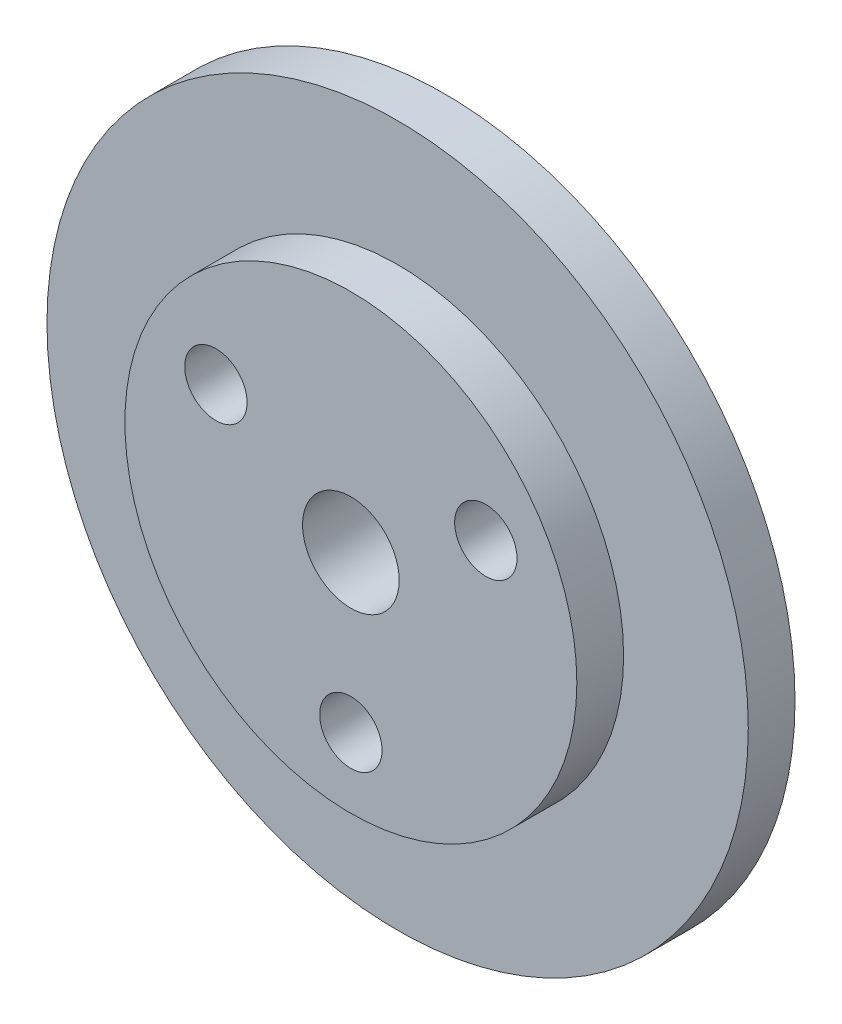
ISO-10303-21;
HEADER;
FILE_DESCRIPTION(('STEP AP214'),'2;1');
FILE_NAME('part.step','',(''),(''),'','','');
FILE_SCHEMA(('AUTOMOTIVE_DESIGN { 1 0 10303 214 1 1 1 1 }'));
ENDSEC;
DATA;
#1=APPLICATION_CONTEXT('core data for automotive mechanical design processes');
#2=APPLICATION_PROTOCOL_DEFINITION('international standard','automotive_design',2000,#1);
#3=PRODUCT_CONTEXT('',#1,'mechanical');
#4=PRODUCT('Part','Part','',(#3));
#5=PRODUCT_RELATED_PRODUCT_CATEGORY('part','',(#4));
#6=PRODUCT_DEFINITION_FORMATION('','',#4);
#7=PRODUCT_DEFINITION_CONTEXT('part definition',#1,'design');
#8=PRODUCT_DEFINITION('design','',#6,#7);
#9=PRODUCT_DEFINITION_SHAPE('','',#8);
#10=(LENGTH_UNIT() NAMED_UNIT(*) SI_UNIT(.MILLI.,.METRE.));
#11=(NAMED_UNIT(*) PLANE_ANGLE_UNIT() SI_UNIT($,.RADIAN.));
#12=(NAMED_UNIT(*) SI_UNIT($,.STERADIAN.) SOLID_ANGLE_UNIT());
#13=UNCERTAINTY_MEASURE_WITH_UNIT(LENGTH_MEASURE(1.E-05),#10,'distance_accuracy_value','');
#14=(GEOMETRIC_REPRESENTATION_CONTEXT(3) GLOBAL_UNCERTAINTY_ASSIGNED_CONTEXT((#13)) GLOBAL_UNIT_ASSIGNED_CONTEXT((#10,
#11,#12)) REPRESENTATION_CONTEXT('',''));
#15=CARTESIAN_POINT('',(0.,0.,0.));
#16=DIRECTION('',(0.,0.,1.));
#17=DIRECTION('',(1.,0.,0.));
#18=AXIS2_PLACEMENT_3D('',#15,#16,#17);
#19=CARTESIAN_POINT('',(0.,0.,3.));
#20=DIRECTION('',(0.,0.,-1.));
#21=DIRECTION('',(-1.,0.,0.));
#22=AXIS2_PLACEMENT_3D('',#19,#20,#21);
#23=CYLINDRICAL_SURFACE('',#22,22.5);
#24=CARTESIAN_POINT('',(0.,0.,3.));
#25=DIRECTION('',(0.,0.,1.));
#26=DIRECTION('',(1.,0.,0.));
#27=AXIS2_PLACEMENT_3D('',#24,#25,#26);
#28=CIRCLE('',#27,22.5);
#29=CARTESIAN_POINT('',(22.5,0.,3.));
#30=VERTEX_POINT('',#29);
#31=EDGE_CURVE('E10',#30,#30,#28,.T.);
#32=ORIENTED_EDGE('',*,*,#31,.F.);
#33=EDGE_LOOP('',(#32));
#34=FACE_BOUND('',#33,.T.);
#35=CARTESIAN_POINT('',(0.,0.,0.));
#36=DIRECTION('',(0.,0.,1.));
#37=DIRECTION('',(1.,0.,0.));
#38=AXIS2_PLACEMENT_3D('',#35,#36,#37);
#39=CIRCLE('',#38,22.5);
#40=CARTESIAN_POINT('',(22.5,0.,0.));
#41=VERTEX_POINT('',#40);
#42=EDGE_CURVE('E34',#41,#41,#39,.T.);
#43=ORIENTED_EDGE('',*,*,#42,.T.);
#44=EDGE_LOOP('',(#43));
#45=FACE_BOUND('',#44,.T.);
#46=ADVANCED_FACE('F31',(#34,#45),#23,.T.);
#47=CARTESIAN_POINT('',(0.,0.,3.));
#48=DIRECTION('',(0.,0.,1.));
#49=DIRECTION('',(1.,0.,0.));
#50=AXIS2_PLACEMENT_3D('',#47,#48,#49);
#51=PLANE('',#50);
#52=CARTESIAN_POINT('',(0.,0.,3.));
#53=DIRECTION('',(0.,0.,1.));
#54=DIRECTION('',(1.,0.,0.));
#55=AXIS2_PLACEMENT_3D('',#52,#53,#54);
#56=CIRCLE('',#55,14.5);
#57=CARTESIAN_POINT('',(14.5,0.,3.));
#58=VERTEX_POINT('',#57);
#59=EDGE_CURVE('E43',#58,#58,#56,.T.);
#60=ORIENTED_EDGE('',*,*,#59,.F.);
#61=EDGE_LOOP('',(#60));
#62=FACE_BOUND('',#61,.T.);
#63=ORIENTED_EDGE('',*,*,#31,.T.);
#64=EDGE_LOOP('',(#63));
#65=FACE_BOUND('',#64,.T.);
#66=ADVANCED_FACE('F102',(#62,#65),#51,.T.);
#67=CARTESIAN_POINT('',(0.,0.,0.));
#68=DIRECTION('',(0.,0.,1.));
#69=DIRECTION('',(1.,0.,0.));
#70=AXIS2_PLACEMENT_3D('',#67,#68,#69);
#71=PLANE('',#70);
#72=CARTESIAN_POINT('',(-8.66025403784436,5.00000000000004,0.));
#73=DIRECTION('',(0.,0.,1.));
#74=DIRECTION('',(1.,0.,0.));
#75=AXIS2_PLACEMENT_3D('',#72,#73,#74);
#76=CIRCLE('',#75,2.);
#77=CARTESIAN_POINT('',(-6.66025403784436,5.00000000000004,0.));
#78=VERTEX_POINT('',#77);
#79=EDGE_CURVE('E52',#78,#78,#76,.T.);
#80=ORIENTED_EDGE('',*,*,#79,.T.);
#81=EDGE_LOOP('',(#80));
#82=FACE_BOUND('',#81,.T.);
#83=CARTESIAN_POINT('',(0.,-10.,0.));
#84=DIRECTION('',(0.,0.,1.));
#85=DIRECTION('',(1.,0.,0.));
#86=AXIS2_PLACEMENT_3D('',#83,#84,#85);
#87=CIRCLE('',#86,2.);
#88=CARTESIAN_POINT('',(2.,-10.,0.));
#89=VERTEX_POINT('',#88);
#90=EDGE_CURVE('E64',#89,#89,#87,.T.);
#91=ORIENTED_EDGE('',*,*,#90,.T.);
#92=EDGE_LOOP('',(#91));
#93=FACE_BOUND('',#92,.T.);
#94=CARTESIAN_POINT('',(0.,0.,0.));
#95=DIRECTION('',(0.,0.,1.));
#96=DIRECTION('',(1.,0.,0.));
#97=AXIS2_PLACEMENT_3D('',#94,#95,#96);
#98=CIRCLE('',#97,3.1);
#99=CARTESIAN_POINT('',(3.1,0.,0.));
#100=VERTEX_POINT('',#99);
#101=EDGE_CURVE('E58',#100,#100,#98,.T.);
#102=ORIENTED_EDGE('',*,*,#101,.T.);
#103=EDGE_LOOP('',(#102));
#104=FACE_BOUND('',#103,.T.);
#105=CARTESIAN_POINT('',(8.66025403784436,5.00000000000004,0.));
#106=DIRECTION('',(0.,0.,1.));
#107=DIRECTION('',(1.,0.,0.));
#108=AXIS2_PLACEMENT_3D('',#105,#106,#107);
#109=CIRCLE('',#108,2.);
#110=CARTESIAN_POINT('',(10.6602540378444,5.00000000000004,0.));
#111=VERTEX_POINT('',#110);
#112=EDGE_CURVE('E46',#111,#111,#109,.T.);
#113=ORIENTED_EDGE('',*,*,#112,.T.);
#114=EDGE_LOOP('',(#113));
#115=FACE_BOUND('',#114,.T.);
#116=ORIENTED_EDGE('',*,*,#42,.F.);
#117=EDGE_LOOP('',(#116));
#118=FACE_BOUND('',#117,.T.);
#119=ADVANCED_FACE('F73',(#82,#93,#104,#115,#118),#71,.F.);
#120=CARTESIAN_POINT('',(0.,0.,6.));
#121=DIRECTION('',(0.,0.,-1.));
#122=DIRECTION('',(-1.,0.,0.));
#123=AXIS2_PLACEMENT_3D('',#120,#121,#122);
#124=CYLINDRICAL_SURFACE('',#123,14.5);
#125=CARTESIAN_POINT('',(0.,0.,6.));
#126=DIRECTION('',(0.,0.,1.));
#127=DIRECTION('',(1.,0.,0.));
#128=AXIS2_PLACEMENT_3D('',#125,#126,#127);
#129=CIRCLE('',#128,14.5);
#130=CARTESIAN_POINT('',(14.5,0.,6.));
#131=VERTEX_POINT('',#130);
#132=EDGE_CURVE('E41',#131,#131,#129,.T.);
#133=ORIENTED_EDGE('',*,*,#132,.F.);
#134=EDGE_LOOP('',(#133));
#135=FACE_BOUND('',#134,.T.);
#136=ORIENTED_EDGE('',*,*,#59,.T.);
#137=EDGE_LOOP('',(#136));
#138=FACE_BOUND('',#137,.T.);
#139=ADVANCED_FACE('F87',(#135,#138),#124,.T.);
#140=CARTESIAN_POINT('',(0.,0.,6.));
#141=DIRECTION('',(0.,0.,1.));
#142=DIRECTION('',(1.,0.,0.));
#143=AXIS2_PLACEMENT_3D('',#140,#141,#142);
#144=PLANE('',#143);
#145=CARTESIAN_POINT('',(-8.66025403784436,5.00000000000004,6.));
#146=DIRECTION('',(0.,0.,1.));
#147=DIRECTION('',(1.,0.,0.));
#148=AXIS2_PLACEMENT_3D('',#145,#146,#147);
#149=CIRCLE('',#148,2.);
#150=CARTESIAN_POINT('',(-6.66025403784436,5.00000000000004,6.));
#151=VERTEX_POINT('',#150);
#152=EDGE_CURVE('E67',#151,#151,#149,.T.);
#153=ORIENTED_EDGE('',*,*,#152,.F.);
#154=EDGE_LOOP('',(#153));
#155=FACE_BOUND('',#154,.T.);
#156=CARTESIAN_POINT('',(0.,-10.,6.));
#157=DIRECTION('',(0.,0.,1.));
#158=DIRECTION('',(1.,0.,0.));
#159=AXIS2_PLACEMENT_3D('',#156,#157,#158);
#160=CIRCLE('',#159,2.);
#161=CARTESIAN_POINT('',(2.,-10.,6.));
#162=VERTEX_POINT('',#161);
#163=EDGE_CURVE('E61',#162,#162,#160,.T.);
#164=ORIENTED_EDGE('',*,*,#163,.F.);
#165=EDGE_LOOP('',(#164));
#166=FACE_BOUND('',#165,.T.);
#167=CARTESIAN_POINT('',(0.,0.,6.));
#168=DIRECTION('',(0.,0.,1.));
#169=DIRECTION('',(1.,0.,0.));
#170=AXIS2_PLACEMENT_3D('',#167,#168,#169);
#171=CIRCLE('',#170,3.1);
#172=CARTESIAN_POINT('',(3.1,0.,6.));
#173=VERTEX_POINT('',#172);
#174=EDGE_CURVE('E55',#173,#173,#171,.T.);
#175=ORIENTED_EDGE('',*,*,#174,.F.);
#176=EDGE_LOOP('',(#175));
#177=FACE_BOUND('',#176,.T.);
#178=CARTESIAN_POINT('',(8.66025403784436,5.00000000000004,6.));
#179=DIRECTION('',(0.,0.,1.));
#180=DIRECTION('',(1.,0.,0.));
#181=AXIS2_PLACEMENT_3D('',#178,#179,#180);
#182=CIRCLE('',#181,2.);
#183=CARTESIAN_POINT('',(10.6602540378444,5.00000000000004,6.));
#184=VERTEX_POINT('',#183);
#185=EDGE_CURVE('E49',#184,#184,#182,.T.);
#186=ORIENTED_EDGE('',*,*,#185,.F.);
#187=EDGE_LOOP('',(#186));
#188=FACE_BOUND('',#187,.T.);
#189=ORIENTED_EDGE('',*,*,#132,.T.);
#190=EDGE_LOOP('',(#189));
#191=FACE_BOUND('',#190,.T.);
#192=ADVANCED_FACE('F83',(#155,#166,#177,#188,#191),#144,.T.);
#193=CARTESIAN_POINT('',(8.66025403784436,5.00000000000004,0.));
#194=DIRECTION('',(0.,0.,1.));
#195=DIRECTION('',(1.,0.,0.));
#196=AXIS2_PLACEMENT_3D('',#193,#194,#195);
#197=CYLINDRICAL_SURFACE('',#196,2.);
#198=ORIENTED_EDGE('',*,*,#112,.F.);
#199=EDGE_LOOP('',(#198));
#200=FACE_BOUND('',#199,.T.);
#201=ORIENTED_EDGE('',*,*,#185,.T.);
#202=EDGE_LOOP('',(#201));
#203=FACE_BOUND('',#202,.T.);
#204=ADVANCED_FACE('F86',(#200,#203),#197,.F.);
#205=CARTESIAN_POINT('',(0.,0.,0.));
#206=DIRECTION('',(0.,0.,1.));
#207=DIRECTION('',(1.,0.,0.));
#208=AXIS2_PLACEMENT_3D('',#205,#206,#207);
#209=CYLINDRICAL_SURFACE('',#208,3.1);
#210=ORIENTED_EDGE('',*,*,#101,.F.);
#211=EDGE_LOOP('',(#210));
#212=FACE_BOUND('',#211,.T.);
#213=ORIENTED_EDGE('',*,*,#174,.T.);
#214=EDGE_LOOP('',(#213));
#215=FACE_BOUND('',#214,.T.);
#216=ADVANCED_FACE('F113',(#212,#215),#209,.F.);
#217=CARTESIAN_POINT('',(0.,-10.,0.));
#218=DIRECTION('',(0.,0.,1.));
#219=DIRECTION('',(1.,0.,0.));
#220=AXIS2_PLACEMENT_3D('',#217,#218,#219);
#221=CYLINDRICAL_SURFACE('',#220,2.);
#222=ORIENTED_EDGE('',*,*,#90,.F.);
#223=EDGE_LOOP('',(#222));
#224=FACE_BOUND('',#223,.T.);
#225=ORIENTED_EDGE('',*,*,#163,.T.);
#226=EDGE_LOOP('',(#225));
#227=FACE_BOUND('',#226,.T.);
#228=ADVANCED_FACE('F79',(#224,#227),#221,.F.);
#229=CARTESIAN_POINT('',(-8.66025403784436,5.00000000000004,0.));
#230=DIRECTION('',(0.,0.,1.));
#231=DIRECTION('',(1.,0.,0.));
#232=AXIS2_PLACEMENT_3D('',#229,#230,#231);
#233=CYLINDRICAL_SURFACE('',#232,2.);
#234=ORIENTED_EDGE('',*,*,#79,.F.);
#235=EDGE_LOOP('',(#234));
#236=FACE_BOUND('',#235,.T.);
#237=ORIENTED_EDGE('',*,*,#152,.T.);
#238=EDGE_LOOP('',(#237));
#239=FACE_BOUND('',#238,.T.);
#240=ADVANCED_FACE('F76',(#236,#239),#233,.F.);
#241=CLOSED_SHELL('',(#46,#66,#119,#139,#192,#204,#216,#228,#240));
#242=MANIFOLD_SOLID_BREP('B2',#241);
#243=ADVANCED_BREP_SHAPE_REPRESENTATION('',(#18,#242),#14);
#244=SHAPE_DEFINITION_REPRESENTATION(#9,#243);
ENDSEC;
END-ISO-10303-21;
